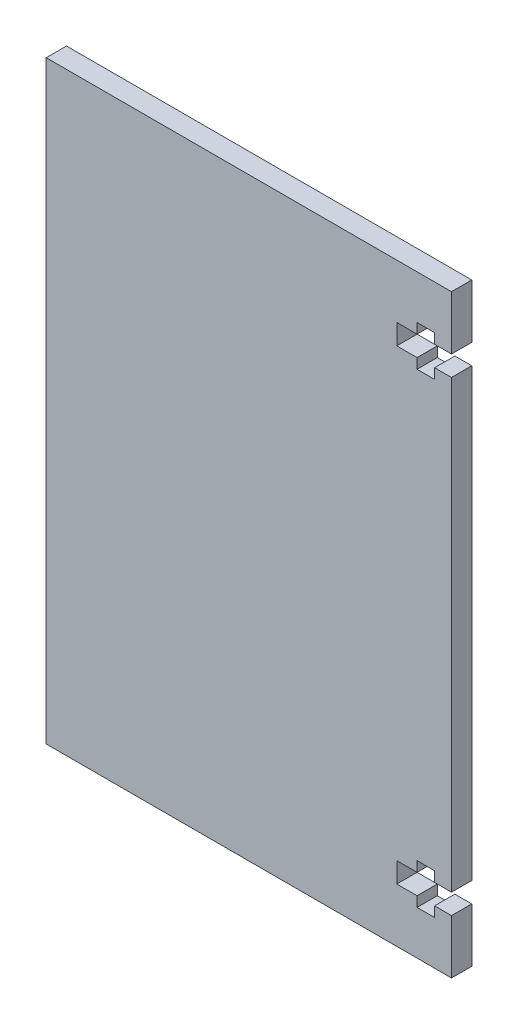
ISO-10303-21;
HEADER;
FILE_DESCRIPTION(('STEP AP214'),'2;1');
FILE_NAME('part.step','',(''),(''),'','','');
FILE_SCHEMA(('AUTOMOTIVE_DESIGN { 1 0 10303 214 1 1 1 1 }'));
ENDSEC;
DATA;
#1=APPLICATION_CONTEXT('core data for automotive mechanical design processes');
#2=APPLICATION_PROTOCOL_DEFINITION('international standard','automotive_design',2000,#1);
#3=PRODUCT_CONTEXT('',#1,'mechanical');
#4=PRODUCT('Part','Part','',(#3));
#5=PRODUCT_RELATED_PRODUCT_CATEGORY('part','',(#4));
#6=PRODUCT_DEFINITION_FORMATION('','',#4);
#7=PRODUCT_DEFINITION_CONTEXT('part definition',#1,'design');
#8=PRODUCT_DEFINITION('design','',#6,#7);
#9=PRODUCT_DEFINITION_SHAPE('','',#8);
#10=(LENGTH_UNIT() NAMED_UNIT(*) SI_UNIT(.MILLI.,.METRE.));
#11=(NAMED_UNIT(*) PLANE_ANGLE_UNIT() SI_UNIT($,.RADIAN.));
#12=(NAMED_UNIT(*) SI_UNIT($,.STERADIAN.) SOLID_ANGLE_UNIT());
#13=UNCERTAINTY_MEASURE_WITH_UNIT(LENGTH_MEASURE(1.E-05),#10,'distance_accuracy_value','');
#14=(GEOMETRIC_REPRESENTATION_CONTEXT(3) GLOBAL_UNCERTAINTY_ASSIGNED_CONTEXT((#13)) GLOBAL_UNIT_ASSIGNED_CONTEXT((#10,
#11,#12)) REPRESENTATION_CONTEXT('',''));
#15=CARTESIAN_POINT('',(0.,0.,0.));
#16=DIRECTION('',(0.,0.,1.));
#17=DIRECTION('',(1.,0.,0.));
#18=AXIS2_PLACEMENT_3D('',#15,#16,#17);
#19=CARTESIAN_POINT('',(1.0325074129014E-11,44.,3.));
#20=DIRECTION('',(0.,-1.,0.));
#21=DIRECTION('',(0.,0.,-1.));
#22=AXIS2_PLACEMENT_3D('',#19,#20,#21);
#23=PLANE('',#22);
#24=DIRECTION('',(-1.,0.,0.));
#25=VECTOR('',#24,1.);
#26=CARTESIAN_POINT('',(1.0325074129014E-11,44.,0.));
#27=LINE('',#26,#25);
#28=CARTESIAN_POINT('',(1.0325074129014E-11,44.,0.));
#29=VERTEX_POINT('',#28);
#30=CARTESIAN_POINT('',(-59.9999999999897,44.,0.));
#31=VERTEX_POINT('',#30);
#32=EDGE_CURVE('E252',#29,#31,#27,.T.);
#33=ORIENTED_EDGE('',*,*,#32,.T.);
#34=DIRECTION('',(0.,0.,-1.));
#35=VECTOR('',#34,1.);
#36=CARTESIAN_POINT('',(-59.9999999999897,44.,3.));
#37=LINE('',#36,#35);
#38=CARTESIAN_POINT('',(-59.9999999999897,44.,3.));
#39=VERTEX_POINT('',#38);
#40=EDGE_CURVE('E11',#39,#31,#37,.T.);
#41=ORIENTED_EDGE('',*,*,#40,.F.);
#42=DIRECTION('',(-1.,0.,0.));
#43=VECTOR('',#42,1.);
#44=CARTESIAN_POINT('',(1.0325074129014E-11,44.,3.));
#45=LINE('',#44,#43);
#46=CARTESIAN_POINT('',(1.0325074129014E-11,44.,3.));
#47=VERTEX_POINT('',#46);
#48=EDGE_CURVE('E306',#47,#39,#45,.T.);
#49=ORIENTED_EDGE('',*,*,#48,.F.);
#50=DIRECTION('',(0.,0.,-1.));
#51=VECTOR('',#50,1.);
#52=CARTESIAN_POINT('',(1.0325074129014E-11,44.,3.));
#53=LINE('',#52,#51);
#54=EDGE_CURVE('E248',#47,#29,#53,.T.);
#55=ORIENTED_EDGE('',*,*,#54,.T.);
#56=EDGE_LOOP('',(#33,#41,#49,#55));
#57=FACE_BOUND('',#56,.T.);
#58=ADVANCED_FACE('F36',(#57),#23,.F.);
#59=CARTESIAN_POINT('',(-59.9999999999897,44.,3.));
#60=DIRECTION('',(1.,0.,0.));
#61=DIRECTION('',(0.,1.,0.));
#62=AXIS2_PLACEMENT_3D('',#59,#60,#61);
#63=PLANE('',#62);
#64=DIRECTION('',(0.,-1.,0.));
#65=VECTOR('',#64,1.);
#66=CARTESIAN_POINT('',(-59.9999999999897,44.,0.));
#67=LINE('',#66,#65);
#68=CARTESIAN_POINT('',(-59.9999999999896,-44.,0.));
#69=VERTEX_POINT('',#68);
#70=EDGE_CURVE('E255',#31,#69,#67,.T.);
#71=ORIENTED_EDGE('',*,*,#70,.T.);
#72=DIRECTION('',(0.,0.,-1.));
#73=VECTOR('',#72,1.);
#74=CARTESIAN_POINT('',(-59.9999999999896,-44.,3.));
#75=LINE('',#74,#73);
#76=CARTESIAN_POINT('',(-59.9999999999896,-44.,3.));
#77=VERTEX_POINT('',#76);
#78=EDGE_CURVE('E44',#77,#69,#75,.T.);
#79=ORIENTED_EDGE('',*,*,#78,.F.);
#80=DIRECTION('',(0.,-1.,0.));
#81=VECTOR('',#80,1.);
#82=CARTESIAN_POINT('',(-59.9999999999897,44.,3.));
#83=LINE('',#82,#81);
#84=EDGE_CURVE('E155',#39,#77,#83,.T.);
#85=ORIENTED_EDGE('',*,*,#84,.F.);
#86=ORIENTED_EDGE('',*,*,#40,.T.);
#87=EDGE_LOOP('',(#71,#79,#85,#86));
#88=FACE_BOUND('',#87,.T.);
#89=ADVANCED_FACE('F464',(#88),#63,.F.);
#90=CARTESIAN_POINT('',(-59.9999999999896,-44.,3.));
#91=DIRECTION('',(0.,1.,0.));
#92=DIRECTION('',(0.,0.,1.));
#93=AXIS2_PLACEMENT_3D('',#90,#91,#92);
#94=PLANE('',#93);
#95=DIRECTION('',(1.,0.,0.));
#96=VECTOR('',#95,1.);
#97=CARTESIAN_POINT('',(-59.9999999999896,-44.,0.));
#98=LINE('',#97,#96);
#99=CARTESIAN_POINT('',(1.0325074129014E-11,-44.,0.));
#100=VERTEX_POINT('',#99);
#101=EDGE_CURVE('E257',#69,#100,#98,.T.);
#102=ORIENTED_EDGE('',*,*,#101,.T.);
#103=DIRECTION('',(0.,0.,-1.));
#104=VECTOR('',#103,1.);
#105=CARTESIAN_POINT('',(1.0325074129014E-11,-44.,3.));
#106=LINE('',#105,#104);
#107=CARTESIAN_POINT('',(1.0325074129014E-11,-44.,3.));
#108=VERTEX_POINT('',#107);
#109=EDGE_CURVE('E373',#108,#100,#106,.T.);
#110=ORIENTED_EDGE('',*,*,#109,.F.);
#111=DIRECTION('',(1.,0.,0.));
#112=VECTOR('',#111,1.);
#113=CARTESIAN_POINT('',(-59.9999999999896,-44.,3.));
#114=LINE('',#113,#112);
#115=EDGE_CURVE('E381',#77,#108,#114,.T.);
#116=ORIENTED_EDGE('',*,*,#115,.F.);
#117=ORIENTED_EDGE('',*,*,#78,.T.);
#118=EDGE_LOOP('',(#102,#110,#116,#117));
#119=FACE_BOUND('',#118,.T.);
#120=ADVANCED_FACE('F379',(#119),#94,.F.);
#121=CARTESIAN_POINT('',(1.0325074129014E-11,-44.,3.));
#122=DIRECTION('',(-1.,0.,0.));
#123=DIRECTION('',(0.,0.,1.));
#124=AXIS2_PLACEMENT_3D('',#121,#122,#123);
#125=PLANE('',#124);
#126=DIRECTION('',(0.,1.,0.));
#127=VECTOR('',#126,1.);
#128=CARTESIAN_POINT('',(1.0325074129014E-11,-44.,0.));
#129=LINE('',#128,#127);
#130=CARTESIAN_POINT('',(1.0325074129014E-11,-36.,0.));
#131=VERTEX_POINT('',#130);
#132=EDGE_CURVE('E259',#100,#131,#129,.T.);
#133=ORIENTED_EDGE('',*,*,#132,.T.);
#134=DIRECTION('',(0.,0.,-1.));
#135=VECTOR('',#134,1.);
#136=CARTESIAN_POINT('',(1.0325074129014E-11,-36.,3.));
#137=LINE('',#136,#135);
#138=CARTESIAN_POINT('',(1.0325074129014E-11,-36.,3.));
#139=VERTEX_POINT('',#138);
#140=EDGE_CURVE('E370',#139,#131,#137,.T.);
#141=ORIENTED_EDGE('',*,*,#140,.F.);
#142=DIRECTION('',(0.,1.,0.));
#143=VECTOR('',#142,1.);
#144=CARTESIAN_POINT('',(1.0325074129014E-11,-44.,3.));
#145=LINE('',#144,#143);
#146=EDGE_CURVE('E399',#108,#139,#145,.T.);
#147=ORIENTED_EDGE('',*,*,#146,.F.);
#148=ORIENTED_EDGE('',*,*,#109,.T.);
#149=EDGE_LOOP('',(#133,#141,#147,#148));
#150=FACE_BOUND('',#149,.T.);
#151=ADVANCED_FACE('F390',(#150),#125,.F.);
#152=CARTESIAN_POINT('',(1.0325074129014E-11,-36.,3.));
#153=DIRECTION('',(0.,-1.,0.));
#154=DIRECTION('',(0.,0.,-1.));
#155=AXIS2_PLACEMENT_3D('',#152,#153,#154);
#156=PLANE('',#155);
#157=DIRECTION('',(-1.,0.,0.));
#158=VECTOR('',#157,1.);
#159=CARTESIAN_POINT('',(1.0325074129014E-11,-36.,0.));
#160=LINE('',#159,#158);
#161=CARTESIAN_POINT('',(-2.49999999997508,-36.,0.));
#162=VERTEX_POINT('',#161);
#163=EDGE_CURVE('E261',#131,#162,#160,.T.);
#164=ORIENTED_EDGE('',*,*,#163,.T.);
#165=DIRECTION('',(0.,0.,-1.));
#166=VECTOR('',#165,1.);
#167=CARTESIAN_POINT('',(-2.49999999997508,-36.,3.));
#168=LINE('',#167,#166);
#169=CARTESIAN_POINT('',(-2.49999999997508,-36.,3.));
#170=VERTEX_POINT('',#169);
#171=EDGE_CURVE('E367',#170,#162,#168,.T.);
#172=ORIENTED_EDGE('',*,*,#171,.F.);
#173=DIRECTION('',(-1.,0.,0.));
#174=VECTOR('',#173,1.);
#175=CARTESIAN_POINT('',(1.0325074129014E-11,-36.,3.));
#176=LINE('',#175,#174);
#177=EDGE_CURVE('E396',#139,#170,#176,.T.);
#178=ORIENTED_EDGE('',*,*,#177,.F.);
#179=ORIENTED_EDGE('',*,*,#140,.T.);
#180=EDGE_LOOP('',(#164,#172,#178,#179));
#181=FACE_BOUND('',#180,.T.);
#182=ADVANCED_FACE('F394',(#181),#156,.F.);
#183=CARTESIAN_POINT('',(-2.49999999997508,-36.,3.));
#184=DIRECTION('',(1.,0.,0.));
#185=DIRECTION('',(0.,0.,-1.));
#186=AXIS2_PLACEMENT_3D('',#183,#184,#185);
#187=PLANE('',#186);
#188=DIRECTION('',(0.,-1.,0.));
#189=VECTOR('',#188,1.);
#190=CARTESIAN_POINT('',(-2.49999999997508,-36.,0.));
#191=LINE('',#190,#189);
#192=CARTESIAN_POINT('',(-2.49999999997508,-37.5000000001613,0.));
#193=VERTEX_POINT('',#192);
#194=EDGE_CURVE('E263',#162,#193,#191,.T.);
#195=ORIENTED_EDGE('',*,*,#194,.T.);
#196=DIRECTION('',(0.,0.,-1.));
#197=VECTOR('',#196,1.);
#198=CARTESIAN_POINT('',(-2.49999999997508,-37.5000000001613,3.));
#199=LINE('',#198,#197);
#200=CARTESIAN_POINT('',(-2.49999999997508,-37.5000000001613,3.));
#201=VERTEX_POINT('',#200);
#202=EDGE_CURVE('E364',#201,#193,#199,.T.);
#203=ORIENTED_EDGE('',*,*,#202,.F.);
#204=DIRECTION('',(0.,-1.,0.));
#205=VECTOR('',#204,1.);
#206=CARTESIAN_POINT('',(-2.49999999997508,-36.,3.));
#207=LINE('',#206,#205);
#208=EDGE_CURVE('E398',#170,#201,#207,.T.);
#209=ORIENTED_EDGE('',*,*,#208,.F.);
#210=ORIENTED_EDGE('',*,*,#171,.T.);
#211=EDGE_LOOP('',(#195,#203,#209,#210));
#212=FACE_BOUND('',#211,.T.);
#213=ADVANCED_FACE('F477',(#212),#187,.F.);
#214=CARTESIAN_POINT('',(-2.49999999997508,-37.5000000001613,3.));
#215=DIRECTION('',(0.,-1.,0.));
#216=DIRECTION('',(0.,0.,-1.));
#217=AXIS2_PLACEMENT_3D('',#214,#215,#216);
#218=PLANE('',#217);
#219=DIRECTION('',(-1.,0.,0.));
#220=VECTOR('',#219,1.);
#221=CARTESIAN_POINT('',(-2.49999999997508,-37.5000000001613,0.));
#222=LINE('',#221,#220);
#223=CARTESIAN_POINT('',(-5.09999999996869,-37.5000000001613,0.));
#224=VERTEX_POINT('',#223);
#225=EDGE_CURVE('E265',#193,#224,#222,.T.);
#226=ORIENTED_EDGE('',*,*,#225,.T.);
#227=DIRECTION('',(0.,0.,-1.));
#228=VECTOR('',#227,1.);
#229=CARTESIAN_POINT('',(-5.09999999996869,-37.5000000001613,3.));
#230=LINE('',#229,#228);
#231=CARTESIAN_POINT('',(-5.09999999996869,-37.5000000001613,3.));
#232=VERTEX_POINT('',#231);
#233=EDGE_CURVE('E361',#232,#224,#230,.T.);
#234=ORIENTED_EDGE('',*,*,#233,.F.);
#235=DIRECTION('',(-1.,0.,0.));
#236=VECTOR('',#235,1.);
#237=CARTESIAN_POINT('',(-2.49999999997508,-37.5000000001613,3.));
#238=LINE('',#237,#236);
#239=EDGE_CURVE('E401',#201,#232,#238,.T.);
#240=ORIENTED_EDGE('',*,*,#239,.F.);
#241=ORIENTED_EDGE('',*,*,#202,.T.);
#242=EDGE_LOOP('',(#226,#234,#240,#241));
#243=FACE_BOUND('',#242,.T.);
#244=ADVANCED_FACE('F480',(#243),#218,.F.);
#245=CARTESIAN_POINT('',(-5.09999999996869,-37.5000000001613,3.));
#246=DIRECTION('',(-1.,0.,0.));
#247=DIRECTION('',(0.,0.,1.));
#248=AXIS2_PLACEMENT_3D('',#245,#246,#247);
#249=PLANE('',#248);
#250=DIRECTION('',(0.,1.,0.));
#251=VECTOR('',#250,1.);
#252=CARTESIAN_POINT('',(-5.09999999996869,-37.5000000001613,0.));
#253=LINE('',#252,#251);
#254=CARTESIAN_POINT('',(-5.09999999996869,-35.9999999999531,0.));
#255=VERTEX_POINT('',#254);
#256=EDGE_CURVE('E267',#224,#255,#253,.T.);
#257=ORIENTED_EDGE('',*,*,#256,.T.);
#258=DIRECTION('',(0.,0.,-1.));
#259=VECTOR('',#258,1.);
#260=CARTESIAN_POINT('',(-5.09999999996869,-35.9999999999531,3.));
#261=LINE('',#260,#259);
#262=CARTESIAN_POINT('',(-5.09999999996869,-35.9999999999531,3.));
#263=VERTEX_POINT('',#262);
#264=EDGE_CURVE('E358',#263,#255,#261,.T.);
#265=ORIENTED_EDGE('',*,*,#264,.F.);
#266=DIRECTION('',(0.,1.,0.));
#267=VECTOR('',#266,1.);
#268=CARTESIAN_POINT('',(-5.09999999996869,-37.5000000001613,3.));
#269=LINE('',#268,#267);
#270=EDGE_CURVE('E407',#232,#263,#269,.T.);
#271=ORIENTED_EDGE('',*,*,#270,.F.);
#272=ORIENTED_EDGE('',*,*,#233,.T.);
#273=EDGE_LOOP('',(#257,#265,#271,#272));
#274=FACE_BOUND('',#273,.T.);
#275=ADVANCED_FACE('F484',(#274),#249,.F.);
#276=CARTESIAN_POINT('',(-5.09999999996869,-35.9999999999531,3.));
#277=DIRECTION('',(0.,-1.,0.));
#278=DIRECTION('',(0.,0.,-1.));
#279=AXIS2_PLACEMENT_3D('',#276,#277,#278);
#280=PLANE('',#279);
#281=DIRECTION('',(-1.,0.,0.));
#282=VECTOR('',#281,1.);
#283=CARTESIAN_POINT('',(-5.09999999996869,-35.9999999999531,0.));
#284=LINE('',#283,#282);
#285=CARTESIAN_POINT('',(-8.10000000000377,-35.9999999999531,0.));
#286=VERTEX_POINT('',#285);
#287=EDGE_CURVE('E269',#255,#286,#284,.T.);
#288=ORIENTED_EDGE('',*,*,#287,.T.);
#289=DIRECTION('',(0.,0.,-1.));
#290=VECTOR('',#289,1.);
#291=CARTESIAN_POINT('',(-8.10000000000377,-35.9999999999531,3.));
#292=LINE('',#291,#290);
#293=CARTESIAN_POINT('',(-8.10000000000377,-35.9999999999531,3.));
#294=VERTEX_POINT('',#293);
#295=EDGE_CURVE('E355',#294,#286,#292,.T.);
#296=ORIENTED_EDGE('',*,*,#295,.F.);
#297=DIRECTION('',(-1.,0.,0.));
#298=VECTOR('',#297,1.);
#299=CARTESIAN_POINT('',(-5.09999999996869,-35.9999999999531,3.));
#300=LINE('',#299,#298);
#301=EDGE_CURVE('E409',#263,#294,#300,.T.);
#302=ORIENTED_EDGE('',*,*,#301,.F.);
#303=ORIENTED_EDGE('',*,*,#264,.T.);
#304=EDGE_LOOP('',(#288,#296,#302,#303));
#305=FACE_BOUND('',#304,.T.);
#306=ADVANCED_FACE('F488',(#305),#280,.F.);
#307=CARTESIAN_POINT('',(-8.10000000000377,-35.9999999999531,3.));
#308=DIRECTION('',(-1.,0.,0.));
#309=DIRECTION('',(0.,0.,1.));
#310=AXIS2_PLACEMENT_3D('',#307,#308,#309);
#311=PLANE('',#310);
#312=DIRECTION('',(0.,1.,0.));
#313=VECTOR('',#312,1.);
#314=CARTESIAN_POINT('',(-8.10000000000377,-35.9999999999531,0.));
#315=LINE('',#314,#313);
#316=CARTESIAN_POINT('',(-8.10000000000377,-33.0000000000799,0.));
#317=VERTEX_POINT('',#316);
#318=EDGE_CURVE('E271',#286,#317,#315,.T.);
#319=ORIENTED_EDGE('',*,*,#318,.T.);
#320=DIRECTION('',(0.,0.,-1.));
#321=VECTOR('',#320,1.);
#322=CARTESIAN_POINT('',(-8.10000000000377,-33.0000000000799,3.));
#323=LINE('',#322,#321);
#324=CARTESIAN_POINT('',(-8.10000000000377,-33.0000000000799,3.));
#325=VERTEX_POINT('',#324);
#326=EDGE_CURVE('E352',#325,#317,#323,.T.);
#327=ORIENTED_EDGE('',*,*,#326,.F.);
#328=DIRECTION('',(0.,1.,0.));
#329=VECTOR('',#328,1.);
#330=CARTESIAN_POINT('',(-8.10000000000377,-35.9999999999531,3.));
#331=LINE('',#330,#329);
#332=EDGE_CURVE('E411',#294,#325,#331,.T.);
#333=ORIENTED_EDGE('',*,*,#332,.F.);
#334=ORIENTED_EDGE('',*,*,#295,.T.);
#335=EDGE_LOOP('',(#319,#327,#333,#334));
#336=FACE_BOUND('',#335,.T.);
#337=ADVANCED_FACE('F492',(#336),#311,.F.);
#338=CARTESIAN_POINT('',(-5.09999999993316,-33.0000000000799,3.));
#339=DIRECTION('',(0.,1.,0.));
#340=DIRECTION('',(0.,0.,1.));
#341=AXIS2_PLACEMENT_3D('',#338,#339,#340);
#342=PLANE('',#341);
#343=DIRECTION('',(1.,0.,0.));
#344=VECTOR('',#343,1.);
#345=CARTESIAN_POINT('',(-5.09999999993316,-33.0000000000799,0.));
#346=LINE('',#345,#344);
#347=CARTESIAN_POINT('',(-5.09999999993316,-33.0000000000799,0.));
#348=VERTEX_POINT('',#347);
#349=EDGE_CURVE('E273',#317,#348,#346,.T.);
#350=ORIENTED_EDGE('',*,*,#349,.T.);
#351=DIRECTION('',(0.,0.,-1.));
#352=VECTOR('',#351,1.);
#353=CARTESIAN_POINT('',(-5.09999999993316,-33.0000000000799,3.));
#354=LINE('',#353,#352);
#355=CARTESIAN_POINT('',(-5.09999999993316,-33.0000000000799,3.));
#356=VERTEX_POINT('',#355);
#357=EDGE_CURVE('E349',#356,#348,#354,.T.);
#358=ORIENTED_EDGE('',*,*,#357,.F.);
#359=DIRECTION('',(1.,0.,0.));
#360=VECTOR('',#359,1.);
#361=CARTESIAN_POINT('',(-5.09999999993316,-33.0000000000799,3.));
#362=LINE('',#361,#360);
#363=EDGE_CURVE('E413',#325,#356,#362,.T.);
#364=ORIENTED_EDGE('',*,*,#363,.F.);
#365=ORIENTED_EDGE('',*,*,#326,.T.);
#366=EDGE_LOOP('',(#350,#358,#364,#365));
#367=FACE_BOUND('',#366,.T.);
#368=ADVANCED_FACE('F496',(#367),#342,.F.);
#369=CARTESIAN_POINT('',(-5.09999999993316,-31.5000000001654,3.));
#370=DIRECTION('',(-1.,0.,0.));
#371=DIRECTION('',(0.,0.,1.));
#372=AXIS2_PLACEMENT_3D('',#369,#370,#371);
#373=PLANE('',#372);
#374=DIRECTION('',(0.,1.,0.));
#375=VECTOR('',#374,1.);
#376=CARTESIAN_POINT('',(-5.09999999993316,-31.5000000001654,0.));
#377=LINE('',#376,#375);
#378=CARTESIAN_POINT('',(-5.09999999993316,-31.5000000001654,0.));
#379=VERTEX_POINT('',#378);
#380=EDGE_CURVE('E275',#348,#379,#377,.T.);
#381=ORIENTED_EDGE('',*,*,#380,.T.);
#382=DIRECTION('',(0.,0.,-1.));
#383=VECTOR('',#382,1.);
#384=CARTESIAN_POINT('',(-5.09999999993316,-31.5000000001654,3.));
#385=LINE('',#384,#383);
#386=CARTESIAN_POINT('',(-5.09999999993316,-31.5000000001654,3.));
#387=VERTEX_POINT('',#386);
#388=EDGE_CURVE('E346',#387,#379,#385,.T.);
#389=ORIENTED_EDGE('',*,*,#388,.F.);
#390=DIRECTION('',(0.,1.,0.));
#391=VECTOR('',#390,1.);
#392=CARTESIAN_POINT('',(-5.09999999993316,-31.5000000001654,3.));
#393=LINE('',#392,#391);
#394=EDGE_CURVE('E415',#356,#387,#393,.T.);
#395=ORIENTED_EDGE('',*,*,#394,.F.);
#396=ORIENTED_EDGE('',*,*,#357,.T.);
#397=EDGE_LOOP('',(#381,#389,#395,#396));
#398=FACE_BOUND('',#397,.T.);
#399=ADVANCED_FACE('F500',(#398),#373,.F.);
#400=CARTESIAN_POINT('',(-2.50000000001438,-31.5000000001654,3.));
#401=DIRECTION('',(0.,1.,0.));
#402=DIRECTION('',(0.,0.,1.));
#403=AXIS2_PLACEMENT_3D('',#400,#401,#402);
#404=PLANE('',#403);
#405=DIRECTION('',(1.,0.,0.));
#406=VECTOR('',#405,1.);
#407=CARTESIAN_POINT('',(-2.50000000001438,-31.5000000001654,0.));
#408=LINE('',#407,#406);
#409=CARTESIAN_POINT('',(-2.50000000001438,-31.5000000001654,0.));
#410=VERTEX_POINT('',#409);
#411=EDGE_CURVE('E277',#379,#410,#408,.T.);
#412=ORIENTED_EDGE('',*,*,#411,.T.);
#413=DIRECTION('',(0.,0.,-1.));
#414=VECTOR('',#413,1.);
#415=CARTESIAN_POINT('',(-2.50000000001438,-31.5000000001654,3.));
#416=LINE('',#415,#414);
#417=CARTESIAN_POINT('',(-2.50000000001438,-31.5000000001654,3.));
#418=VERTEX_POINT('',#417);
#419=EDGE_CURVE('E343',#418,#410,#416,.T.);
#420=ORIENTED_EDGE('',*,*,#419,.F.);
#421=DIRECTION('',(1.,0.,0.));
#422=VECTOR('',#421,1.);
#423=CARTESIAN_POINT('',(-2.50000000001438,-31.5000000001654,3.));
#424=LINE('',#423,#422);
#425=EDGE_CURVE('E417',#387,#418,#424,.T.);
#426=ORIENTED_EDGE('',*,*,#425,.F.);
#427=ORIENTED_EDGE('',*,*,#388,.T.);
#428=EDGE_LOOP('',(#412,#420,#426,#427));
#429=FACE_BOUND('',#428,.T.);
#430=ADVANCED_FACE('F504',(#429),#404,.F.);
#431=CARTESIAN_POINT('',(-2.50000000001438,-33.0000000000328,3.));
#432=DIRECTION('',(1.,0.,0.));
#433=DIRECTION('',(0.,0.,-1.));
#434=AXIS2_PLACEMENT_3D('',#431,#432,#433);
#435=PLANE('',#434);
#436=DIRECTION('',(0.,-1.,0.));
#437=VECTOR('',#436,1.);
#438=CARTESIAN_POINT('',(-2.50000000001438,-33.0000000000328,0.));
#439=LINE('',#438,#437);
#440=CARTESIAN_POINT('',(-2.50000000001438,-33.0000000000328,0.));
#441=VERTEX_POINT('',#440);
#442=EDGE_CURVE('E279',#410,#441,#439,.T.);
#443=ORIENTED_EDGE('',*,*,#442,.T.);
#444=DIRECTION('',(0.,0.,-1.));
#445=VECTOR('',#444,1.);
#446=CARTESIAN_POINT('',(-2.50000000001438,-33.0000000000328,3.));
#447=LINE('',#446,#445);
#448=CARTESIAN_POINT('',(-2.50000000001438,-33.0000000000328,3.));
#449=VERTEX_POINT('',#448);
#450=EDGE_CURVE('E340',#449,#441,#447,.T.);
#451=ORIENTED_EDGE('',*,*,#450,.F.);
#452=DIRECTION('',(0.,-1.,0.));
#453=VECTOR('',#452,1.);
#454=CARTESIAN_POINT('',(-2.50000000001438,-33.0000000000328,3.));
#455=LINE('',#454,#453);
#456=EDGE_CURVE('E419',#418,#449,#455,.T.);
#457=ORIENTED_EDGE('',*,*,#456,.F.);
#458=ORIENTED_EDGE('',*,*,#419,.T.);
#459=EDGE_LOOP('',(#443,#451,#457,#458));
#460=FACE_BOUND('',#459,.T.);
#461=ADVANCED_FACE('F508',(#460),#435,.F.);
#462=CARTESIAN_POINT('',(-2.50000000001438,-33.0000000000328,3.));
#463=DIRECTION('',(0.,1.,0.));
#464=DIRECTION('',(0.,0.,1.));
#465=AXIS2_PLACEMENT_3D('',#462,#463,#464);
#466=PLANE('',#465);
#467=DIRECTION('',(1.,0.,0.));
#468=VECTOR('',#467,1.);
#469=CARTESIAN_POINT('',(-2.50000000001438,-33.0000000000328,0.));
#470=LINE('',#469,#468);
#471=CARTESIAN_POINT('',(0.,-33.0000000000328,0.));
#472=VERTEX_POINT('',#471);
#473=EDGE_CURVE('E281',#441,#472,#470,.T.);
#474=ORIENTED_EDGE('',*,*,#473,.T.);
#475=DIRECTION('',(0.,0.,-1.));
#476=VECTOR('',#475,1.);
#477=CARTESIAN_POINT('',(0.,-33.0000000000328,3.));
#478=LINE('',#477,#476);
#479=CARTESIAN_POINT('',(0.,-33.0000000000328,3.));
#480=VERTEX_POINT('',#479);
#481=EDGE_CURVE('E337',#480,#472,#478,.T.);
#482=ORIENTED_EDGE('',*,*,#481,.F.);
#483=DIRECTION('',(1.,0.,0.));
#484=VECTOR('',#483,1.);
#485=CARTESIAN_POINT('',(-2.50000000001438,-33.0000000000328,3.));
#486=LINE('',#485,#484);
#487=EDGE_CURVE('E421',#449,#480,#486,.T.);
#488=ORIENTED_EDGE('',*,*,#487,.F.);
#489=ORIENTED_EDGE('',*,*,#450,.T.);
#490=EDGE_LOOP('',(#474,#482,#488,#489));
#491=FACE_BOUND('',#490,.T.);
#492=ADVANCED_FACE('F512',(#491),#466,.F.);
#493=CARTESIAN_POINT('',(0.,-33.0000000000328,3.));
#494=DIRECTION('',(-1.,0.,0.));
#495=DIRECTION('',(0.,0.,1.));
#496=AXIS2_PLACEMENT_3D('',#493,#494,#495);
#497=PLANE('',#496);
#498=DIRECTION('',(0.,1.,0.));
#499=VECTOR('',#498,1.);
#500=CARTESIAN_POINT('',(0.,-33.0000000000328,0.));
#501=LINE('',#500,#499);
#502=CARTESIAN_POINT('',(0.,33.0000000000328,0.));
#503=VERTEX_POINT('',#502);
#504=EDGE_CURVE('E283',#472,#503,#501,.T.);
#505=ORIENTED_EDGE('',*,*,#504,.T.);
#506=DIRECTION('',(0.,0.,-1.));
#507=VECTOR('',#506,1.);
#508=CARTESIAN_POINT('',(0.,33.0000000000328,3.));
#509=LINE('',#508,#507);
#510=CARTESIAN_POINT('',(0.,33.0000000000328,3.));
#511=VERTEX_POINT('',#510);
#512=EDGE_CURVE('E334',#511,#503,#509,.T.);
#513=ORIENTED_EDGE('',*,*,#512,.F.);
#514=DIRECTION('',(0.,1.,0.));
#515=VECTOR('',#514,1.);
#516=CARTESIAN_POINT('',(0.,-33.0000000000328,3.));
#517=LINE('',#516,#515);
#518=EDGE_CURVE('E423',#480,#511,#517,.T.);
#519=ORIENTED_EDGE('',*,*,#518,.F.);
#520=ORIENTED_EDGE('',*,*,#481,.T.);
#521=EDGE_LOOP('',(#505,#513,#519,#520));
#522=FACE_BOUND('',#521,.T.);
#523=ADVANCED_FACE('F516',(#522),#497,.F.);
#524=CARTESIAN_POINT('',(0.,33.0000000000328,3.));
#525=DIRECTION('',(0.,-1.,0.));
#526=DIRECTION('',(0.,0.,-1.));
#527=AXIS2_PLACEMENT_3D('',#524,#525,#526);
#528=PLANE('',#527);
#529=DIRECTION('',(-1.,0.,0.));
#530=VECTOR('',#529,1.);
#531=CARTESIAN_POINT('',(0.,33.0000000000328,0.));
#532=LINE('',#531,#530);
#533=CARTESIAN_POINT('',(-2.49999999996475,33.0000000000328,0.));
#534=VERTEX_POINT('',#533);
#535=EDGE_CURVE('E285',#503,#534,#532,.T.);
#536=ORIENTED_EDGE('',*,*,#535,.T.);
#537=DIRECTION('',(0.,0.,-1.));
#538=VECTOR('',#537,1.);
#539=CARTESIAN_POINT('',(-2.49999999996475,33.0000000000328,3.));
#540=LINE('',#539,#538);
#541=CARTESIAN_POINT('',(-2.49999999996475,33.0000000000328,3.));
#542=VERTEX_POINT('',#541);
#543=EDGE_CURVE('E331',#542,#534,#540,.T.);
#544=ORIENTED_EDGE('',*,*,#543,.F.);
#545=DIRECTION('',(-1.,0.,0.));
#546=VECTOR('',#545,1.);
#547=CARTESIAN_POINT('',(0.,33.0000000000328,3.));
#548=LINE('',#547,#546);
#549=EDGE_CURVE('E425',#511,#542,#548,.T.);
#550=ORIENTED_EDGE('',*,*,#549,.F.);
#551=ORIENTED_EDGE('',*,*,#512,.T.);
#552=EDGE_LOOP('',(#536,#544,#550,#551));
#553=FACE_BOUND('',#552,.T.);
#554=ADVANCED_FACE('F520',(#553),#528,.F.);
#555=CARTESIAN_POINT('',(-2.49999999996475,33.0000000000328,3.));
#556=DIRECTION('',(1.,0.,0.));
#557=DIRECTION('',(0.,0.,-1.));
#558=AXIS2_PLACEMENT_3D('',#555,#556,#557);
#559=PLANE('',#558);
#560=DIRECTION('',(0.,-1.,0.));
#561=VECTOR('',#560,1.);
#562=CARTESIAN_POINT('',(-2.49999999996475,33.0000000000328,0.));
#563=LINE('',#562,#561);
#564=CARTESIAN_POINT('',(-2.49999999996475,31.4999999998715,0.));
#565=VERTEX_POINT('',#564);
#566=EDGE_CURVE('E287',#534,#565,#563,.T.);
#567=ORIENTED_EDGE('',*,*,#566,.T.);
#568=DIRECTION('',(0.,0.,-1.));
#569=VECTOR('',#568,1.);
#570=CARTESIAN_POINT('',(-2.49999999996475,31.4999999998715,3.));
#571=LINE('',#570,#569);
#572=CARTESIAN_POINT('',(-2.49999999996475,31.4999999998715,3.));
#573=VERTEX_POINT('',#572);
#574=EDGE_CURVE('E328',#573,#565,#571,.T.);
#575=ORIENTED_EDGE('',*,*,#574,.F.);
#576=DIRECTION('',(0.,-1.,0.));
#577=VECTOR('',#576,1.);
#578=CARTESIAN_POINT('',(-2.49999999996475,33.0000000000328,3.));
#579=LINE('',#578,#577);
#580=EDGE_CURVE('E427',#542,#573,#579,.T.);
#581=ORIENTED_EDGE('',*,*,#580,.F.);
#582=ORIENTED_EDGE('',*,*,#543,.T.);
#583=EDGE_LOOP('',(#567,#575,#581,#582));
#584=FACE_BOUND('',#583,.T.);
#585=ADVANCED_FACE('F524',(#584),#559,.F.);
#586=CARTESIAN_POINT('',(-2.49999999996475,31.4999999998715,3.));
#587=DIRECTION('',(0.,-1.,0.));
#588=DIRECTION('',(0.,0.,-1.));
#589=AXIS2_PLACEMENT_3D('',#586,#587,#588);
#590=PLANE('',#589);
#591=DIRECTION('',(-1.,0.,0.));
#592=VECTOR('',#591,1.);
#593=CARTESIAN_POINT('',(-2.49999999996475,31.4999999998715,0.));
#594=LINE('',#593,#592);
#595=CARTESIAN_POINT('',(-5.09999999995836,31.4999999998715,0.));
#596=VERTEX_POINT('',#595);
#597=EDGE_CURVE('E289',#565,#596,#594,.T.);
#598=ORIENTED_EDGE('',*,*,#597,.T.);
#599=DIRECTION('',(0.,0.,-1.));
#600=VECTOR('',#599,1.);
#601=CARTESIAN_POINT('',(-5.09999999995836,31.4999999998715,3.));
#602=LINE('',#601,#600);
#603=CARTESIAN_POINT('',(-5.09999999995836,31.4999999998715,3.));
#604=VERTEX_POINT('',#603);
#605=EDGE_CURVE('E325',#604,#596,#602,.T.);
#606=ORIENTED_EDGE('',*,*,#605,.F.);
#607=DIRECTION('',(-1.,0.,0.));
#608=VECTOR('',#607,1.);
#609=CARTESIAN_POINT('',(-2.49999999996475,31.4999999998715,3.));
#610=LINE('',#609,#608);
#611=EDGE_CURVE('E429',#573,#604,#610,.T.);
#612=ORIENTED_EDGE('',*,*,#611,.F.);
#613=ORIENTED_EDGE('',*,*,#574,.T.);
#614=EDGE_LOOP('',(#598,#606,#612,#613));
#615=FACE_BOUND('',#614,.T.);
#616=ADVANCED_FACE('F528',(#615),#590,.F.);
#617=CARTESIAN_POINT('',(-5.09999999995836,31.4999999998715,3.));
#618=DIRECTION('',(-1.,0.,0.));
#619=DIRECTION('',(0.,0.,1.));
#620=AXIS2_PLACEMENT_3D('',#617,#618,#619);
#621=PLANE('',#620);
#622=DIRECTION('',(0.,1.,0.));
#623=VECTOR('',#622,1.);
#624=CARTESIAN_POINT('',(-5.09999999995836,31.4999999998715,0.));
#625=LINE('',#624,#623);
#626=CARTESIAN_POINT('',(-5.09999999995836,33.0000000000797,0.));
#627=VERTEX_POINT('',#626);
#628=EDGE_CURVE('E291',#596,#627,#625,.T.);
#629=ORIENTED_EDGE('',*,*,#628,.T.);
#630=DIRECTION('',(0.,0.,-1.));
#631=VECTOR('',#630,1.);
#632=CARTESIAN_POINT('',(-5.09999999995836,33.0000000000797,3.));
#633=LINE('',#632,#631);
#634=CARTESIAN_POINT('',(-5.09999999995836,33.0000000000797,3.));
#635=VERTEX_POINT('',#634);
#636=EDGE_CURVE('E322',#635,#627,#633,.T.);
#637=ORIENTED_EDGE('',*,*,#636,.F.);
#638=DIRECTION('',(0.,1.,0.));
#639=VECTOR('',#638,1.);
#640=CARTESIAN_POINT('',(-5.09999999995836,31.4999999998715,3.));
#641=LINE('',#640,#639);
#642=EDGE_CURVE('E431',#604,#635,#641,.T.);
#643=ORIENTED_EDGE('',*,*,#642,.F.);
#644=ORIENTED_EDGE('',*,*,#605,.T.);
#645=EDGE_LOOP('',(#629,#637,#643,#644));
#646=FACE_BOUND('',#645,.T.);
#647=ADVANCED_FACE('F532',(#646),#621,.F.);
#648=CARTESIAN_POINT('',(-5.09999999995836,33.0000000000797,3.));
#649=DIRECTION('',(0.,-1.,0.));
#650=DIRECTION('',(0.,0.,-1.));
#651=AXIS2_PLACEMENT_3D('',#648,#649,#650);
#652=PLANE('',#651);
#653=DIRECTION('',(-1.,0.,0.));
#654=VECTOR('',#653,1.);
#655=CARTESIAN_POINT('',(-5.09999999995836,33.0000000000797,0.));
#656=LINE('',#655,#654);
#657=CARTESIAN_POINT('',(-8.09999999999345,33.0000000000797,0.));
#658=VERTEX_POINT('',#657);
#659=EDGE_CURVE('E293',#627,#658,#656,.T.);
#660=ORIENTED_EDGE('',*,*,#659,.T.);
#661=DIRECTION('',(0.,0.,-1.));
#662=VECTOR('',#661,1.);
#663=CARTESIAN_POINT('',(-8.09999999999345,33.0000000000797,3.));
#664=LINE('',#663,#662);
#665=CARTESIAN_POINT('',(-8.09999999999345,33.0000000000797,3.));
#666=VERTEX_POINT('',#665);
#667=EDGE_CURVE('E319',#666,#658,#664,.T.);
#668=ORIENTED_EDGE('',*,*,#667,.F.);
#669=DIRECTION('',(-1.,0.,0.));
#670=VECTOR('',#669,1.);
#671=CARTESIAN_POINT('',(-5.09999999995836,33.0000000000797,3.));
#672=LINE('',#671,#670);
#673=EDGE_CURVE('E433',#635,#666,#672,.T.);
#674=ORIENTED_EDGE('',*,*,#673,.F.);
#675=ORIENTED_EDGE('',*,*,#636,.T.);
#676=EDGE_LOOP('',(#660,#668,#674,#675));
#677=FACE_BOUND('',#676,.T.);
#678=ADVANCED_FACE('F536',(#677),#652,.F.);
#679=CARTESIAN_POINT('',(-8.09999999999345,33.0000000000797,3.));
#680=DIRECTION('',(-1.,0.,0.));
#681=DIRECTION('',(0.,0.,1.));
#682=AXIS2_PLACEMENT_3D('',#679,#680,#681);
#683=PLANE('',#682);
#684=DIRECTION('',(0.,1.,0.));
#685=VECTOR('',#684,1.);
#686=CARTESIAN_POINT('',(-8.09999999999345,33.0000000000797,0.));
#687=LINE('',#686,#685);
#688=CARTESIAN_POINT('',(-8.09999999999345,35.9999999999529,0.));
#689=VERTEX_POINT('',#688);
#690=EDGE_CURVE('E295',#658,#689,#687,.T.);
#691=ORIENTED_EDGE('',*,*,#690,.T.);
#692=DIRECTION('',(0.,0.,-1.));
#693=VECTOR('',#692,1.);
#694=CARTESIAN_POINT('',(-8.09999999999345,35.9999999999529,3.));
#695=LINE('',#694,#693);
#696=CARTESIAN_POINT('',(-8.09999999999345,35.9999999999529,3.));
#697=VERTEX_POINT('',#696);
#698=EDGE_CURVE('E316',#697,#689,#695,.T.);
#699=ORIENTED_EDGE('',*,*,#698,.F.);
#700=DIRECTION('',(0.,1.,0.));
#701=VECTOR('',#700,1.);
#702=CARTESIAN_POINT('',(-8.09999999999345,33.0000000000797,3.));
#703=LINE('',#702,#701);
#704=EDGE_CURVE('E435',#666,#697,#703,.T.);
#705=ORIENTED_EDGE('',*,*,#704,.F.);
#706=ORIENTED_EDGE('',*,*,#667,.T.);
#707=EDGE_LOOP('',(#691,#699,#705,#706));
#708=FACE_BOUND('',#707,.T.);
#709=ADVANCED_FACE('F540',(#708),#683,.F.);
#710=CARTESIAN_POINT('',(-5.09999999992283,35.9999999999529,3.));
#711=DIRECTION('',(0.,1.,0.));
#712=DIRECTION('',(0.,0.,1.));
#713=AXIS2_PLACEMENT_3D('',#710,#711,#712);
#714=PLANE('',#713);
#715=DIRECTION('',(1.,0.,0.));
#716=VECTOR('',#715,1.);
#717=CARTESIAN_POINT('',(-5.09999999992283,35.9999999999529,0.));
#718=LINE('',#717,#716);
#719=CARTESIAN_POINT('',(-5.09999999992283,35.9999999999529,0.));
#720=VERTEX_POINT('',#719);
#721=EDGE_CURVE('E297',#689,#720,#718,.T.);
#722=ORIENTED_EDGE('',*,*,#721,.T.);
#723=DIRECTION('',(0.,0.,-1.));
#724=VECTOR('',#723,1.);
#725=CARTESIAN_POINT('',(-5.09999999992283,35.9999999999529,3.));
#726=LINE('',#725,#724);
#727=CARTESIAN_POINT('',(-5.09999999992283,35.9999999999529,3.));
#728=VERTEX_POINT('',#727);
#729=EDGE_CURVE('E313',#728,#720,#726,.T.);
#730=ORIENTED_EDGE('',*,*,#729,.F.);
#731=DIRECTION('',(1.,0.,0.));
#732=VECTOR('',#731,1.);
#733=CARTESIAN_POINT('',(-5.09999999992283,35.9999999999529,3.));
#734=LINE('',#733,#732);
#735=EDGE_CURVE('E437',#697,#728,#734,.T.);
#736=ORIENTED_EDGE('',*,*,#735,.F.);
#737=ORIENTED_EDGE('',*,*,#698,.T.);
#738=EDGE_LOOP('',(#722,#730,#736,#737));
#739=FACE_BOUND('',#738,.T.);
#740=ADVANCED_FACE('F544',(#739),#714,.F.);
#741=CARTESIAN_POINT('',(-5.09999999992283,37.4999999998674,3.));
#742=DIRECTION('',(-1.,0.,0.));
#743=DIRECTION('',(0.,0.,1.));
#744=AXIS2_PLACEMENT_3D('',#741,#742,#743);
#745=PLANE('',#744);
#746=DIRECTION('',(0.,1.,0.));
#747=VECTOR('',#746,1.);
#748=CARTESIAN_POINT('',(-5.09999999992283,37.4999999998674,0.));
#749=LINE('',#748,#747);
#750=CARTESIAN_POINT('',(-5.09999999992283,37.4999999998674,0.));
#751=VERTEX_POINT('',#750);
#752=EDGE_CURVE('E299',#720,#751,#749,.T.);
#753=ORIENTED_EDGE('',*,*,#752,.T.);
#754=DIRECTION('',(0.,0.,-1.));
#755=VECTOR('',#754,1.);
#756=CARTESIAN_POINT('',(-5.09999999992283,37.4999999998674,3.));
#757=LINE('',#756,#755);
#758=CARTESIAN_POINT('',(-5.09999999992283,37.4999999998674,3.));
#759=VERTEX_POINT('',#758);
#760=EDGE_CURVE('E310',#759,#751,#757,.T.);
#761=ORIENTED_EDGE('',*,*,#760,.F.);
#762=DIRECTION('',(0.,1.,0.));
#763=VECTOR('',#762,1.);
#764=CARTESIAN_POINT('',(-5.09999999992283,37.4999999998674,3.));
#765=LINE('',#764,#763);
#766=EDGE_CURVE('E439',#728,#759,#765,.T.);
#767=ORIENTED_EDGE('',*,*,#766,.F.);
#768=ORIENTED_EDGE('',*,*,#729,.T.);
#769=EDGE_LOOP('',(#753,#761,#767,#768));
#770=FACE_BOUND('',#769,.T.);
#771=ADVANCED_FACE('F445',(#770),#745,.F.);
#772=CARTESIAN_POINT('',(-2.50000000000405,37.4999999998674,3.));
#773=DIRECTION('',(0.,1.,0.));
#774=DIRECTION('',(0.,0.,1.));
#775=AXIS2_PLACEMENT_3D('',#772,#773,#774);
#776=PLANE('',#775);
#777=DIRECTION('',(1.,0.,0.));
#778=VECTOR('',#777,1.);
#779=CARTESIAN_POINT('',(-2.50000000000405,37.4999999998674,0.));
#780=LINE('',#779,#778);
#781=CARTESIAN_POINT('',(-2.50000000000405,37.4999999998674,0.));
#782=VERTEX_POINT('',#781);
#783=EDGE_CURVE('E301',#751,#782,#780,.T.);
#784=ORIENTED_EDGE('',*,*,#783,.T.);
#785=DIRECTION('',(0.,0.,-1.));
#786=VECTOR('',#785,1.);
#787=CARTESIAN_POINT('',(-2.50000000000405,37.4999999998674,3.));
#788=LINE('',#787,#786);
#789=CARTESIAN_POINT('',(-2.50000000000405,37.4999999998674,3.));
#790=VERTEX_POINT('',#789);
#791=EDGE_CURVE('E243',#790,#782,#788,.T.);
#792=ORIENTED_EDGE('',*,*,#791,.F.);
#793=DIRECTION('',(1.,0.,0.));
#794=VECTOR('',#793,1.);
#795=CARTESIAN_POINT('',(-2.50000000000405,37.4999999998674,3.));
#796=LINE('',#795,#794);
#797=EDGE_CURVE('E234',#759,#790,#796,.T.);
#798=ORIENTED_EDGE('',*,*,#797,.F.);
#799=ORIENTED_EDGE('',*,*,#760,.T.);
#800=EDGE_LOOP('',(#784,#792,#798,#799));
#801=FACE_BOUND('',#800,.T.);
#802=ADVANCED_FACE('F449',(#801),#776,.F.);
#803=CARTESIAN_POINT('',(-2.50000000000405,36.,3.));
#804=DIRECTION('',(1.,0.,0.));
#805=DIRECTION('',(0.,0.,-1.));
#806=AXIS2_PLACEMENT_3D('',#803,#804,#805);
#807=PLANE('',#806);
#808=DIRECTION('',(0.,-1.,0.));
#809=VECTOR('',#808,1.);
#810=CARTESIAN_POINT('',(-2.50000000000405,36.,0.));
#811=LINE('',#810,#809);
#812=CARTESIAN_POINT('',(-2.50000000000405,36.,0.));
#813=VERTEX_POINT('',#812);
#814=EDGE_CURVE('E242',#782,#813,#811,.T.);
#815=ORIENTED_EDGE('',*,*,#814,.T.);
#816=DIRECTION('',(0.,0.,-1.));
#817=VECTOR('',#816,1.);
#818=CARTESIAN_POINT('',(-2.50000000000405,36.,3.));
#819=LINE('',#818,#817);
#820=CARTESIAN_POINT('',(-2.50000000000405,36.,3.));
#821=VERTEX_POINT('',#820);
#822=EDGE_CURVE('E239',#821,#813,#819,.T.);
#823=ORIENTED_EDGE('',*,*,#822,.F.);
#824=DIRECTION('',(0.,-1.,0.));
#825=VECTOR('',#824,1.);
#826=CARTESIAN_POINT('',(-2.50000000000405,36.,3.));
#827=LINE('',#826,#825);
#828=EDGE_CURVE('E228',#790,#821,#827,.T.);
#829=ORIENTED_EDGE('',*,*,#828,.F.);
#830=ORIENTED_EDGE('',*,*,#791,.T.);
#831=EDGE_LOOP('',(#815,#823,#829,#830));
#832=FACE_BOUND('',#831,.T.);
#833=ADVANCED_FACE('F240',(#832),#807,.F.);
#834=CARTESIAN_POINT('',(-2.50000000000405,36.,3.));
#835=DIRECTION('',(0.,1.,0.));
#836=DIRECTION('',(0.,0.,1.));
#837=AXIS2_PLACEMENT_3D('',#834,#835,#836);
#838=PLANE('',#837);
#839=DIRECTION('',(1.,0.,0.));
#840=VECTOR('',#839,1.);
#841=CARTESIAN_POINT('',(-2.50000000000405,36.,0.));
#842=LINE('',#841,#840);
#843=CARTESIAN_POINT('',(1.0325074129014E-11,36.,0.));
#844=VERTEX_POINT('',#843);
#845=EDGE_CURVE('E141',#813,#844,#842,.T.);
#846=ORIENTED_EDGE('',*,*,#845,.T.);
#847=DIRECTION('',(0.,0.,-1.));
#848=VECTOR('',#847,1.);
#849=CARTESIAN_POINT('',(1.0325074129014E-11,36.,3.));
#850=LINE('',#849,#848);
#851=CARTESIAN_POINT('',(1.0325074129014E-11,36.,3.));
#852=VERTEX_POINT('',#851);
#853=EDGE_CURVE('E244',#852,#844,#850,.T.);
#854=ORIENTED_EDGE('',*,*,#853,.F.);
#855=DIRECTION('',(1.,0.,0.));
#856=VECTOR('',#855,1.);
#857=CARTESIAN_POINT('',(-2.50000000000405,36.,3.));
#858=LINE('',#857,#856);
#859=EDGE_CURVE('E232',#821,#852,#858,.T.);
#860=ORIENTED_EDGE('',*,*,#859,.F.);
#861=ORIENTED_EDGE('',*,*,#822,.T.);
#862=EDGE_LOOP('',(#846,#854,#860,#861));
#863=FACE_BOUND('',#862,.T.);
#864=ADVANCED_FACE('F246',(#863),#838,.F.);
#865=CARTESIAN_POINT('',(1.0325074129014E-11,44.,3.));
#866=DIRECTION('',(-1.,0.,0.));
#867=DIRECTION('',(0.,0.,1.));
#868=AXIS2_PLACEMENT_3D('',#865,#866,#867);
#869=PLANE('',#868);
#870=DIRECTION('',(0.,1.,0.));
#871=VECTOR('',#870,1.);
#872=CARTESIAN_POINT('',(1.0325074129014E-11,44.,0.));
#873=LINE('',#872,#871);
#874=EDGE_CURVE('E147',#844,#29,#873,.T.);
#875=ORIENTED_EDGE('',*,*,#874,.T.);
#876=ORIENTED_EDGE('',*,*,#54,.F.);
#877=DIRECTION('',(0.,1.,0.));
#878=VECTOR('',#877,1.);
#879=CARTESIAN_POINT('',(1.0325074129014E-11,44.,3.));
#880=LINE('',#879,#878);
#881=EDGE_CURVE('E52',#852,#47,#880,.T.);
#882=ORIENTED_EDGE('',*,*,#881,.F.);
#883=ORIENTED_EDGE('',*,*,#853,.T.);
#884=EDGE_LOOP('',(#875,#876,#882,#883));
#885=FACE_BOUND('',#884,.T.);
#886=ADVANCED_FACE('F453',(#885),#869,.F.);
#887=CARTESIAN_POINT('',(0.,0.,3.));
#888=DIRECTION('',(0.,0.,1.));
#889=DIRECTION('',(1.,0.,0.));
#890=AXIS2_PLACEMENT_3D('',#887,#888,#889);
#891=PLANE('',#890);
#892=ORIENTED_EDGE('',*,*,#48,.T.);
#893=ORIENTED_EDGE('',*,*,#84,.T.);
#894=ORIENTED_EDGE('',*,*,#115,.T.);
#895=ORIENTED_EDGE('',*,*,#146,.T.);
#896=ORIENTED_EDGE('',*,*,#177,.T.);
#897=ORIENTED_EDGE('',*,*,#208,.T.);
#898=ORIENTED_EDGE('',*,*,#239,.T.);
#899=ORIENTED_EDGE('',*,*,#270,.T.);
#900=ORIENTED_EDGE('',*,*,#301,.T.);
#901=ORIENTED_EDGE('',*,*,#332,.T.);
#902=ORIENTED_EDGE('',*,*,#363,.T.);
#903=ORIENTED_EDGE('',*,*,#394,.T.);
#904=ORIENTED_EDGE('',*,*,#425,.T.);
#905=ORIENTED_EDGE('',*,*,#456,.T.);
#906=ORIENTED_EDGE('',*,*,#487,.T.);
#907=ORIENTED_EDGE('',*,*,#518,.T.);
#908=ORIENTED_EDGE('',*,*,#549,.T.);
#909=ORIENTED_EDGE('',*,*,#580,.T.);
#910=ORIENTED_EDGE('',*,*,#611,.T.);
#911=ORIENTED_EDGE('',*,*,#642,.T.);
#912=ORIENTED_EDGE('',*,*,#673,.T.);
#913=ORIENTED_EDGE('',*,*,#704,.T.);
#914=ORIENTED_EDGE('',*,*,#735,.T.);
#915=ORIENTED_EDGE('',*,*,#766,.T.);
#916=ORIENTED_EDGE('',*,*,#797,.T.);
#917=ORIENTED_EDGE('',*,*,#828,.T.);
#918=ORIENTED_EDGE('',*,*,#859,.T.);
#919=ORIENTED_EDGE('',*,*,#881,.T.);
#920=EDGE_LOOP('',(#892,#893,#894,#895,#896,#897,#898,#899,#900,#901,#902,#903,#904,#905,#906,
#907,#908,#909,#910,#911,#912,#913,#914,#915,#916,#917,#918,#919));
#921=FACE_BOUND('',#920,.T.);
#922=ADVANCED_FACE('F230',(#921),#891,.T.);
#923=CARTESIAN_POINT('',(0.,0.,0.));
#924=DIRECTION('',(0.,0.,1.));
#925=DIRECTION('',(1.,0.,0.));
#926=AXIS2_PLACEMENT_3D('',#923,#924,#925);
#927=PLANE('',#926);
#928=ORIENTED_EDGE('',*,*,#32,.F.);
#929=ORIENTED_EDGE('',*,*,#874,.F.);
#930=ORIENTED_EDGE('',*,*,#845,.F.);
#931=ORIENTED_EDGE('',*,*,#814,.F.);
#932=ORIENTED_EDGE('',*,*,#783,.F.);
#933=ORIENTED_EDGE('',*,*,#752,.F.);
#934=ORIENTED_EDGE('',*,*,#721,.F.);
#935=ORIENTED_EDGE('',*,*,#690,.F.);
#936=ORIENTED_EDGE('',*,*,#659,.F.);
#937=ORIENTED_EDGE('',*,*,#628,.F.);
#938=ORIENTED_EDGE('',*,*,#597,.F.);
#939=ORIENTED_EDGE('',*,*,#566,.F.);
#940=ORIENTED_EDGE('',*,*,#535,.F.);
#941=ORIENTED_EDGE('',*,*,#504,.F.);
#942=ORIENTED_EDGE('',*,*,#473,.F.);
#943=ORIENTED_EDGE('',*,*,#442,.F.);
#944=ORIENTED_EDGE('',*,*,#411,.F.);
#945=ORIENTED_EDGE('',*,*,#380,.F.);
#946=ORIENTED_EDGE('',*,*,#349,.F.);
#947=ORIENTED_EDGE('',*,*,#318,.F.);
#948=ORIENTED_EDGE('',*,*,#287,.F.);
#949=ORIENTED_EDGE('',*,*,#256,.F.);
#950=ORIENTED_EDGE('',*,*,#225,.F.);
#951=ORIENTED_EDGE('',*,*,#194,.F.);
#952=ORIENTED_EDGE('',*,*,#163,.F.);
#953=ORIENTED_EDGE('',*,*,#132,.F.);
#954=ORIENTED_EDGE('',*,*,#101,.F.);
#955=ORIENTED_EDGE('',*,*,#70,.F.);
#956=EDGE_LOOP('',(#928,#929,#930,#931,#932,#933,#934,#935,#936,#937,#938,#939,#940,#941,#942,
#943,#944,#945,#946,#947,#948,#949,#950,#951,#952,#953,#954,#955));
#957=FACE_BOUND('',#956,.T.);
#958=ADVANCED_FACE('F385',(#957),#927,.F.);
#959=CLOSED_SHELL('',(#58,#89,#120,#151,#182,#213,#244,#275,#306,#337,#368,#399,#430,#461,#492,
#523,#554,#585,#616,#647,#678,#709,#740,#771,#802,#833,#864,#886,#922,#958));
#960=MANIFOLD_SOLID_BREP('B2',#959);
#961=ADVANCED_BREP_SHAPE_REPRESENTATION('',(#18,#960),#14);
#962=SHAPE_DEFINITION_REPRESENTATION(#9,#961);
ENDSEC;
END-ISO-10303-21;
